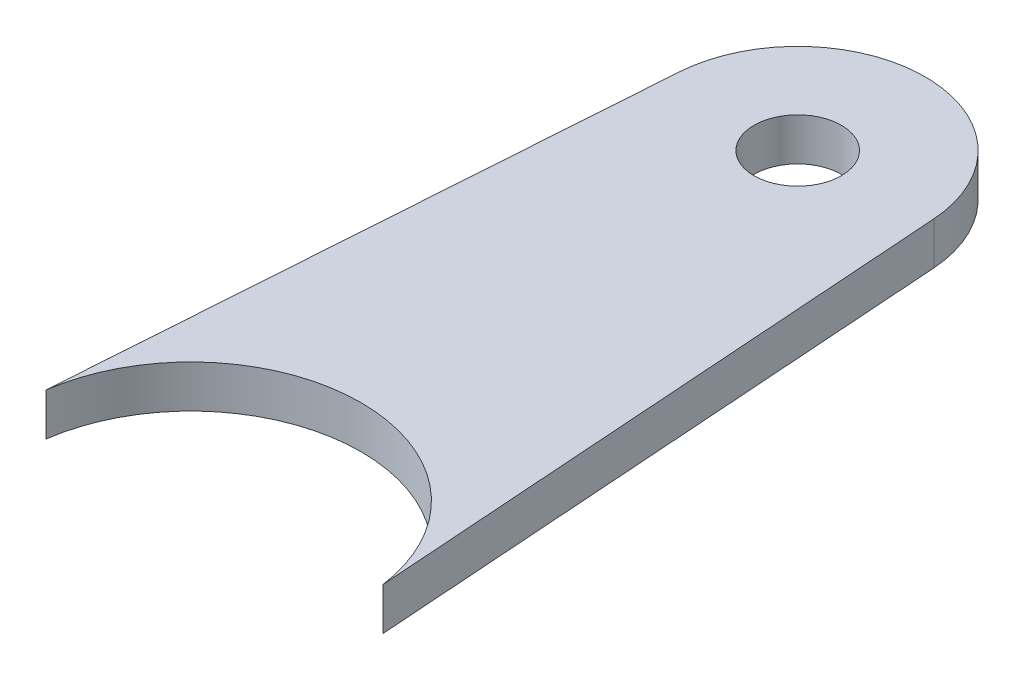
ISO-10303-21;
HEADER;
FILE_DESCRIPTION(('STEP AP214'),'2;1');
FILE_NAME('part.step','',(''),(''),'','','');
FILE_SCHEMA(('AUTOMOTIVE_DESIGN { 1 0 10303 214 1 1 1 1 }'));
ENDSEC;
DATA;
#1=APPLICATION_CONTEXT('core data for automotive mechanical design processes');
#2=APPLICATION_PROTOCOL_DEFINITION('international standard','automotive_design',2000,#1);
#3=PRODUCT_CONTEXT('',#1,'mechanical');
#4=PRODUCT('Part','Part','',(#3));
#5=PRODUCT_RELATED_PRODUCT_CATEGORY('part','',(#4));
#6=PRODUCT_DEFINITION_FORMATION('','',#4);
#7=PRODUCT_DEFINITION_CONTEXT('part definition',#1,'design');
#8=PRODUCT_DEFINITION('design','',#6,#7);
#9=PRODUCT_DEFINITION_SHAPE('','',#8);
#10=(LENGTH_UNIT() NAMED_UNIT(*) SI_UNIT(.MILLI.,.METRE.));
#11=(NAMED_UNIT(*) PLANE_ANGLE_UNIT() SI_UNIT($,.RADIAN.));
#12=(NAMED_UNIT(*) SI_UNIT($,.STERADIAN.) SOLID_ANGLE_UNIT());
#13=UNCERTAINTY_MEASURE_WITH_UNIT(LENGTH_MEASURE(1.E-05),#10,'distance_accuracy_value','');
#14=(GEOMETRIC_REPRESENTATION_CONTEXT(3) GLOBAL_UNCERTAINTY_ASSIGNED_CONTEXT((#13)) GLOBAL_UNIT_ASSIGNED_CONTEXT((#10,
#11,#12)) REPRESENTATION_CONTEXT('',''));
#15=CARTESIAN_POINT('',(0.,0.,0.));
#16=DIRECTION('',(0.,0.,1.));
#17=DIRECTION('',(1.,0.,0.));
#18=AXIS2_PLACEMENT_3D('',#15,#16,#17);
#19=CARTESIAN_POINT('',(0.,3.175,0.));
#20=DIRECTION('',(-0.997588430618348,0.,-0.0694069383881889));
#21=DIRECTION('',(-0.0694069383881889,0.,0.997588430618348));
#22=AXIS2_PLACEMENT_3D('',#19,#20,#21);
#23=PLANE('',#22);
#24=DIRECTION('',(0.0694069383881889,0.,-0.997588430618348));
#25=VECTOR('',#24,1.);
#26=CARTESIAN_POINT('',(0.,0.,0.));
#27=LINE('',#26,#25);
#28=CARTESIAN_POINT('',(0.122360006649107,0.,-1.75868479201369));
#29=VERTEX_POINT('',#28);
#30=CARTESIAN_POINT('',(3.19797019836023,0.,-45.9645410881475));
#31=VERTEX_POINT('',#30);
#32=EDGE_CURVE('E121',#29,#31,#27,.T.);
#33=ORIENTED_EDGE('',*,*,#32,.F.);
#34=DIRECTION('',(0.,-1.,0.));
#35=VECTOR('',#34,1.);
#36=CARTESIAN_POINT('',(0.122360006649107,3.175,-1.75868479201369));
#37=LINE('',#36,#35);
#38=CARTESIAN_POINT('',(0.122360006649107,3.175,-1.75868479201369));
#39=VERTEX_POINT('',#38);
#40=EDGE_CURVE('E11',#39,#29,#37,.T.);
#41=ORIENTED_EDGE('',*,*,#40,.F.);
#42=DIRECTION('',(0.0694069383881889,0.,-0.997588430618348));
#43=VECTOR('',#42,1.);
#44=CARTESIAN_POINT('',(0.,3.175,0.));
#45=LINE('',#44,#43);
#46=CARTESIAN_POINT('',(3.19797019836023,3.175,-45.9645410881475));
#47=VERTEX_POINT('',#46);
#48=EDGE_CURVE('E108',#39,#47,#45,.T.);
#49=ORIENTED_EDGE('',*,*,#48,.T.);
#50=DIRECTION('',(0.,-1.,0.));
#51=VECTOR('',#50,1.);
#52=CARTESIAN_POINT('',(3.19797019836023,3.175,-45.9645410881475));
#53=LINE('',#52,#51);
#54=EDGE_CURVE('E63',#47,#31,#53,.T.);
#55=ORIENTED_EDGE('',*,*,#54,.T.);
#56=EDGE_LOOP('',(#33,#41,#49,#55));
#57=FACE_BOUND('',#56,.T.);
#58=ADVANCED_FACE('F46',(#57),#23,.T.);
#59=CARTESIAN_POINT('',(12.7,3.175,0.));
#60=DIRECTION('',(0.,-1.,0.));
#61=DIRECTION('',(0.,0.,-1.));
#62=AXIS2_PLACEMENT_3D('',#59,#60,#61);
#63=CYLINDRICAL_SURFACE('',#62,12.7);
#64=CARTESIAN_POINT('',(12.7,0.,0.));
#65=DIRECTION('',(0.,1.,0.));
#66=DIRECTION('',(0.,0.,1.));
#67=AXIS2_PLACEMENT_3D('',#64,#65,#66);
#68=CIRCLE('',#67,12.7);
#69=CARTESIAN_POINT('',(25.2776399933509,0.,-1.75868479201375));
#70=VERTEX_POINT('',#69);
#71=EDGE_CURVE('E95',#70,#29,#68,.T.);
#72=ORIENTED_EDGE('',*,*,#71,.F.);
#73=DIRECTION('',(0.,-1.,0.));
#74=VECTOR('',#73,1.);
#75=CARTESIAN_POINT('',(25.2776399933509,3.175,-1.75868479201375));
#76=LINE('',#75,#74);
#77=CARTESIAN_POINT('',(25.2776399933509,3.175,-1.75868479201375));
#78=VERTEX_POINT('',#77);
#79=EDGE_CURVE('E55',#78,#70,#76,.T.);
#80=ORIENTED_EDGE('',*,*,#79,.F.);
#81=CARTESIAN_POINT('',(12.7,3.175,0.));
#82=DIRECTION('',(0.,1.,0.));
#83=DIRECTION('',(0.,0.,1.));
#84=AXIS2_PLACEMENT_3D('',#81,#82,#83);
#85=CIRCLE('',#84,12.7);
#86=EDGE_CURVE('E93',#78,#39,#85,.T.);
#87=ORIENTED_EDGE('',*,*,#86,.T.);
#88=ORIENTED_EDGE('',*,*,#40,.T.);
#89=EDGE_LOOP('',(#72,#80,#87,#88));
#90=FACE_BOUND('',#89,.T.);
#91=ADVANCED_FACE('F91',(#90),#63,.F.);
#92=CARTESIAN_POINT('',(25.2776399933509,3.175,-1.75868479201372));
#93=DIRECTION('',(-0.997588430618348,0.,0.0694069383881889));
#94=DIRECTION('',(0.0694069383881889,0.,0.997588430618348));
#95=AXIS2_PLACEMENT_3D('',#92,#93,#94);
#96=PLANE('',#95);
#97=DIRECTION('',(-0.0694069383881889,0.,-0.997588430618348));
#98=VECTOR('',#97,1.);
#99=CARTESIAN_POINT('',(25.2776399933509,0.,-1.75868479201372));
#100=LINE('',#99,#98);
#101=CARTESIAN_POINT('',(22.2020298016398,0.,-45.9645410881475));
#102=VERTEX_POINT('',#101);
#103=EDGE_CURVE('E126',#70,#102,#100,.T.);
#104=ORIENTED_EDGE('',*,*,#103,.T.);
#105=DIRECTION('',(0.,-1.,0.));
#106=VECTOR('',#105,1.);
#107=CARTESIAN_POINT('',(22.2020298016398,3.175,-45.9645410881475));
#108=LINE('',#107,#106);
#109=CARTESIAN_POINT('',(22.2020298016398,3.175,-45.9645410881475));
#110=VERTEX_POINT('',#109);
#111=EDGE_CURVE('E77',#110,#102,#108,.T.);
#112=ORIENTED_EDGE('',*,*,#111,.F.);
#113=DIRECTION('',(-0.0694069383881889,0.,-0.997588430618348));
#114=VECTOR('',#113,1.);
#115=CARTESIAN_POINT('',(25.2776399933509,3.175,-1.75868479201372));
#116=LINE('',#115,#114);
#117=EDGE_CURVE('E99',#78,#110,#116,.T.);
#118=ORIENTED_EDGE('',*,*,#117,.F.);
#119=ORIENTED_EDGE('',*,*,#79,.T.);
#120=EDGE_LOOP('',(#104,#112,#118,#119));
#121=FACE_BOUND('',#120,.T.);
#122=ADVANCED_FACE('F100',(#121),#96,.F.);
#123=CARTESIAN_POINT('',(12.7,3.175,-45.30344));
#124=DIRECTION('',(0.,-1.,0.));
#125=DIRECTION('',(0.,0.,-1.));
#126=AXIS2_PLACEMENT_3D('',#123,#124,#125);
#127=CYLINDRICAL_SURFACE('',#126,9.525);
#128=CARTESIAN_POINT('',(12.7,0.,-45.30344));
#129=DIRECTION('',(0.,1.,0.));
#130=DIRECTION('',(0.,0.,1.));
#131=AXIS2_PLACEMENT_3D('',#128,#129,#130);
#132=CIRCLE('',#131,9.525);
#133=EDGE_CURVE('E129',#31,#102,#132,.F.);
#134=ORIENTED_EDGE('',*,*,#133,.F.);
#135=ORIENTED_EDGE('',*,*,#54,.F.);
#136=CARTESIAN_POINT('',(12.7,3.175,-45.30344));
#137=DIRECTION('',(0.,1.,0.));
#138=DIRECTION('',(0.,0.,1.));
#139=AXIS2_PLACEMENT_3D('',#136,#137,#138);
#140=CIRCLE('',#139,9.525);
#141=EDGE_CURVE('E104',#47,#110,#140,.F.);
#142=ORIENTED_EDGE('',*,*,#141,.T.);
#143=ORIENTED_EDGE('',*,*,#111,.T.);
#144=EDGE_LOOP('',(#134,#135,#142,#143));
#145=FACE_BOUND('',#144,.T.);
#146=ADVANCED_FACE('F145',(#145),#127,.T.);
#147=CARTESIAN_POINT('',(12.7,3.175,-45.30344));
#148=DIRECTION('',(0.,-1.,0.));
#149=DIRECTION('',(0.,0.,-1.));
#150=AXIS2_PLACEMENT_3D('',#147,#148,#149);
#151=CYLINDRICAL_SURFACE('',#150,3.2639);
#152=CARTESIAN_POINT('',(12.7,3.175,-45.30344));
#153=DIRECTION('',(0.,1.,0.));
#154=DIRECTION('',(0.,0.,1.));
#155=AXIS2_PLACEMENT_3D('',#152,#153,#154);
#156=CIRCLE('',#155,3.2639);
#157=CARTESIAN_POINT('',(12.7,3.175,-42.03954));
#158=VERTEX_POINT('',#157);
#159=EDGE_CURVE('E117',#158,#158,#156,.T.);
#160=ORIENTED_EDGE('',*,*,#159,.T.);
#161=EDGE_LOOP('',(#160));
#162=FACE_BOUND('',#161,.T.);
#163=CARTESIAN_POINT('',(12.7,0.,-45.30344));
#164=DIRECTION('',(0.,1.,0.));
#165=DIRECTION('',(0.,0.,1.));
#166=AXIS2_PLACEMENT_3D('',#163,#164,#165);
#167=CIRCLE('',#166,3.2639);
#168=CARTESIAN_POINT('',(12.7,0.,-42.03954));
#169=VERTEX_POINT('',#168);
#170=EDGE_CURVE('E112',#169,#169,#167,.T.);
#171=ORIENTED_EDGE('',*,*,#170,.F.);
#172=EDGE_LOOP('',(#171));
#173=FACE_BOUND('',#172,.T.);
#174=ADVANCED_FACE('F143',(#162,#173),#151,.F.);
#175=CARTESIAN_POINT('',(0.,3.175,0.));
#176=DIRECTION('',(0.,1.,0.));
#177=DIRECTION('',(0.,0.,1.));
#178=AXIS2_PLACEMENT_3D('',#175,#176,#177);
#179=PLANE('',#178);
#180=ORIENTED_EDGE('',*,*,#48,.F.);
#181=ORIENTED_EDGE('',*,*,#86,.F.);
#182=ORIENTED_EDGE('',*,*,#117,.T.);
#183=ORIENTED_EDGE('',*,*,#141,.F.);
#184=EDGE_LOOP('',(#180,#181,#182,#183));
#185=FACE_BOUND('',#184,.T.);
#186=ORIENTED_EDGE('',*,*,#159,.F.);
#187=EDGE_LOOP('',(#186));
#188=FACE_BOUND('',#187,.T.);
#189=ADVANCED_FACE('F106',(#185,#188),#179,.T.);
#190=CARTESIAN_POINT('',(0.,0.,0.));
#191=DIRECTION('',(0.,1.,0.));
#192=DIRECTION('',(0.,0.,1.));
#193=AXIS2_PLACEMENT_3D('',#190,#191,#192);
#194=PLANE('',#193);
#195=ORIENTED_EDGE('',*,*,#32,.T.);
#196=ORIENTED_EDGE('',*,*,#133,.T.);
#197=ORIENTED_EDGE('',*,*,#103,.F.);
#198=ORIENTED_EDGE('',*,*,#71,.T.);
#199=EDGE_LOOP('',(#195,#196,#197,#198));
#200=FACE_BOUND('',#199,.T.);
#201=ORIENTED_EDGE('',*,*,#170,.T.);
#202=EDGE_LOOP('',(#201));
#203=FACE_BOUND('',#202,.T.);
#204=ADVANCED_FACE('F141',(#200,#203),#194,.F.);
#205=CLOSED_SHELL('',(#58,#91,#122,#146,#174,#189,#204));
#206=MANIFOLD_SOLID_BREP('B2',#205);
#207=ADVANCED_BREP_SHAPE_REPRESENTATION('',(#18,#206),#14);
#208=SHAPE_DEFINITION_REPRESENTATION(#9,#207);
ENDSEC;
END-ISO-10303-21;
